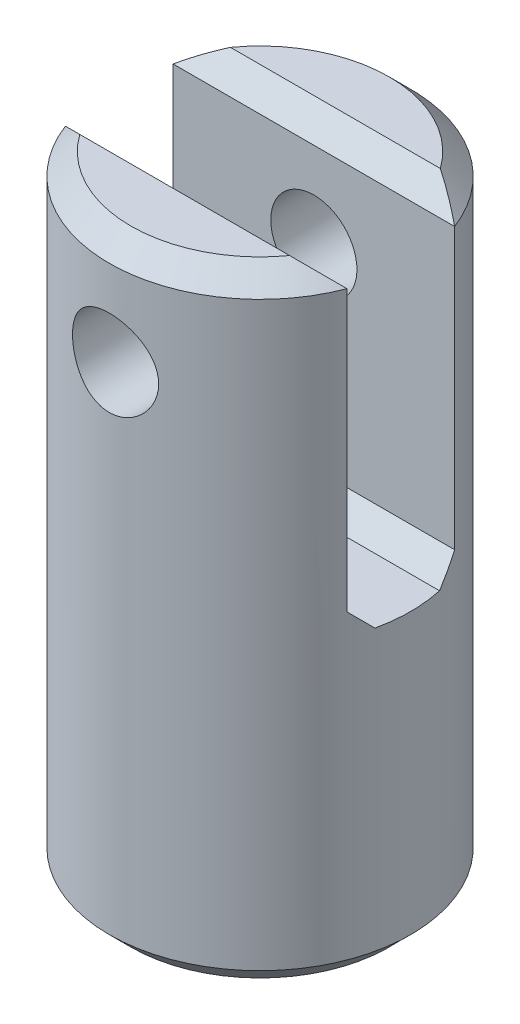
ISO-10303-21;
HEADER;
FILE_DESCRIPTION(('STEP AP214'),'2;1');
FILE_NAME('part.step','',(''),(''),'','','');
FILE_SCHEMA(('AUTOMOTIVE_DESIGN { 1 0 10303 214 1 1 1 1 }'));
ENDSEC;
DATA;
#1=APPLICATION_CONTEXT('core data for automotive mechanical design processes');
#2=APPLICATION_PROTOCOL_DEFINITION('international standard','automotive_design',2000,#1);
#3=PRODUCT_CONTEXT('',#1,'mechanical');
#4=PRODUCT('Part','Part','',(#3));
#5=PRODUCT_RELATED_PRODUCT_CATEGORY('part','',(#4));
#6=PRODUCT_DEFINITION_FORMATION('','',#4);
#7=PRODUCT_DEFINITION_CONTEXT('part definition',#1,'design');
#8=PRODUCT_DEFINITION('design','',#6,#7);
#9=PRODUCT_DEFINITION_SHAPE('','',#8);
#10=(LENGTH_UNIT() NAMED_UNIT(*) SI_UNIT(.MILLI.,.METRE.));
#11=(NAMED_UNIT(*) PLANE_ANGLE_UNIT() SI_UNIT($,.RADIAN.));
#12=(NAMED_UNIT(*) SI_UNIT($,.STERADIAN.) SOLID_ANGLE_UNIT());
#13=UNCERTAINTY_MEASURE_WITH_UNIT(LENGTH_MEASURE(1.E-05),#10,'distance_accuracy_value','');
#14=(GEOMETRIC_REPRESENTATION_CONTEXT(3) GLOBAL_UNCERTAINTY_ASSIGNED_CONTEXT((#13)) GLOBAL_UNIT_ASSIGNED_CONTEXT((#10,
#11,#12)) REPRESENTATION_CONTEXT('',''));
#15=CARTESIAN_POINT('',(0.,0.,0.));
#16=DIRECTION('',(0.,0.,1.));
#17=DIRECTION('',(1.,0.,0.));
#18=AXIS2_PLACEMENT_3D('',#15,#16,#17);
#19=CARTESIAN_POINT('',(0.,14.5,0.));
#20=DIRECTION('',(0.,1.,0.));
#21=DIRECTION('',(0.,0.,1.));
#22=AXIS2_PLACEMENT_3D('',#19,#20,#21);
#23=PLANE('',#22);
#24=DIRECTION('',(-1.,0.,0.));
#25=VECTOR('',#24,1.);
#26=CARTESIAN_POINT('',(-6.53834841531101,14.5,3.50000000000001));
#27=LINE('',#26,#25);
#28=CARTESIAN_POINT('',(4.87339717240447,14.5,3.50000000000001));
#29=VERTEX_POINT('',#28);
#30=CARTESIAN_POINT('',(-4.87339717240447,14.5,3.50000000000001));
#31=VERTEX_POINT('',#30);
#32=EDGE_CURVE('E62',#29,#31,#27,.T.);
#33=ORIENTED_EDGE('',*,*,#32,.T.);
#34=CARTESIAN_POINT('',(0.,14.5,0.));
#35=DIRECTION('',(0.,1.,0.));
#36=DIRECTION('',(0.,0.,1.));
#37=AXIS2_PLACEMENT_3D('',#34,#35,#36);
#38=CIRCLE('',#37,5.99999999999999);
#39=EDGE_CURVE('E146',#31,#29,#38,.T.);
#40=ORIENTED_EDGE('',*,*,#39,.T.);
#41=EDGE_LOOP('',(#33,#40));
#42=FACE_BOUND('',#41,.T.);
#43=ADVANCED_FACE('F39',(#42),#23,.T.);
#44=CARTESIAN_POINT('',(0.,14.5,0.));
#45=DIRECTION('',(0.,-1.,0.));
#46=DIRECTION('',(0.,0.,-1.));
#47=AXIS2_PLACEMENT_3D('',#44,#45,#46);
#48=CYLINDRICAL_SURFACE('',#47,7.);
#49=CARTESIAN_POINT('',(0.,-13.5,0.));
#50=DIRECTION('',(0.,1.,0.));
#51=DIRECTION('',(0.,0.,1.));
#52=AXIS2_PLACEMENT_3D('',#49,#50,#51);
#53=CIRCLE('',#52,7.);
#54=CARTESIAN_POINT('',(0.,-13.5,7.));
#55=VERTEX_POINT('',#54);
#56=EDGE_CURVE('E222',#55,#55,#53,.T.);
#57=ORIENTED_EDGE('',*,*,#56,.T.);
#58=EDGE_LOOP('',(#57));
#59=FACE_BOUND('',#58,.T.);
#60=CARTESIAN_POINT('',(0.,11.5,-7.));
#61=CARTESIAN_POINT('',(-0.109954902377251,11.4999980604381,-6.99999869294341));
#62=CARTESIAN_POINT('',(-0.219929747872581,11.4909022110239,-6.99738417402043));
#63=CARTESIAN_POINT('',(-0.436691991196989,11.4548357298977,-6.98720905945103));
#64=CARTESIAN_POINT('',(-0.543478166829616,11.4278583339259,-6.97964659210084));
#65=CARTESIAN_POINT('',(-0.750704300737871,11.3569919615835,-6.96040691349073));
#66=CARTESIAN_POINT('',(-0.851152880848224,11.3131265638481,-6.94873544106341));
#67=CARTESIAN_POINT('',(-1.04326876112927,11.2098220085217,-6.92249978316544));
#68=CARTESIAN_POINT('',(-1.13493514117816,11.1503812215096,-6.90793529508022));
#69=CARTESIAN_POINT('',(-1.30929444685895,11.0159649893271,-6.8770473462558));
#70=CARTESIAN_POINT('',(-1.39172372238094,10.9406552461447,-6.86069041945191));
#71=CARTESIAN_POINT('',(-1.54297135792435,10.7773522568623,-6.82826734915641));
#72=CARTESIAN_POINT('',(-1.61178767707782,10.6893571123678,-6.81220124959344));
#73=CARTESIAN_POINT('',(-1.7351979000643,10.5010064172091,-6.78183014875388));
#74=CARTESIAN_POINT('',(-1.78947821103348,10.4004380149351,-6.76756702506018));
#75=CARTESIAN_POINT('',(-1.8802517055398,10.1911279882492,-6.74291343840667));
#76=CARTESIAN_POINT('',(-1.91674871555719,10.0823881279291,-6.73252214244871));
#77=CARTESIAN_POINT('',(-1.96998433013875,9.86276523683446,-6.71713608196016));
#78=CARTESIAN_POINT('',(-1.98720553202849,9.75200863723217,-6.71200978570011));
#79=CARTESIAN_POINT('',(-2.00290667789184,9.5290688515539,-6.70734208201995));
#80=CARTESIAN_POINT('',(-2.00139069409621,9.41688598074978,-6.70779946107612));
#81=CARTESIAN_POINT('',(-1.98004134762903,9.19813138854384,-6.71413034409934));
#82=CARTESIAN_POINT('',(-1.96080325728391,9.09149564881924,-6.71982782697936));
#83=CARTESIAN_POINT('',(-1.90551386085789,8.88303278037241,-6.73571348382811));
#84=CARTESIAN_POINT('',(-1.8694610348125,8.7812060872795,-6.74590206376403));
#85=CARTESIAN_POINT('',(-1.78110681137812,8.58375375556819,-6.7697686351608));
#86=CARTESIAN_POINT('',(-1.72860551172881,8.48822292759833,-6.78348916405649));
#87=CARTESIAN_POINT('',(-1.60898379167885,8.3071234387866,-6.81285216882059));
#88=CARTESIAN_POINT('',(-1.54186011673345,8.22155700226509,-6.82849507221912));
#89=CARTESIAN_POINT('',(-1.39190399673021,8.05942762439363,-6.86066250656356));
#90=CARTESIAN_POINT('',(-1.30857487484533,7.98332552403277,-6.87719804572366));
#91=CARTESIAN_POINT('',(-1.13013228238622,7.84607399635972,-6.90876247218345));
#92=CARTESIAN_POINT('',(-1.03501820148189,7.78492534395829,-6.92379128137825));
#93=CARTESIAN_POINT('',(-0.834923073091445,7.67907126522596,-6.95076528065502));
#94=CARTESIAN_POINT('',(-0.729889817810005,7.63445971319582,-6.96269275497229));
#95=CARTESIAN_POINT('',(-0.513393229967469,7.56366610858318,-6.98199251487585));
#96=CARTESIAN_POINT('',(-0.401931525810145,7.53747941075473,-6.98936594856255));
#97=CARTESIAN_POINT('',(-0.179666388644349,7.50502671429055,-6.99854874514672));
#98=CARTESIAN_POINT('',(-0.068961346860507,7.49813530462697,-7.00053272850599));
#99=CARTESIAN_POINT('',(0.152026526805584,7.50272726630104,-6.99922084707091));
#100=CARTESIAN_POINT('',(0.262309407757109,7.51420843284592,-6.99592561580629));
#101=CARTESIAN_POINT('',(0.477018633430316,7.55471044431625,-6.98453926685206));
#102=CARTESIAN_POINT('',(0.581518211734844,7.58337318132339,-6.97654613017679));
#103=CARTESIAN_POINT('',(0.784208686205641,7.65700050198467,-6.95667998741883));
#104=CARTESIAN_POINT('',(0.882398851248718,7.70196697088934,-6.94480653265874));
#105=CARTESIAN_POINT('',(1.07204168512003,7.80802333664512,-6.91809961169145));
#106=CARTESIAN_POINT('',(1.16330248654009,7.86944119882533,-6.9032076317834));
#107=CARTESIAN_POINT('',(1.33443852805947,8.0062525059511,-6.87217947098441));
#108=CARTESIAN_POINT('',(1.41431117084304,8.08164913006457,-6.85604300755107));
#109=CARTESIAN_POINT('',(1.56310642834007,8.24720934204944,-6.82368619629443));
#110=CARTESIAN_POINT('',(1.63158542740713,8.33777527555905,-6.80748036858305));
#111=CARTESIAN_POINT('',(1.75239531606757,8.52946258862467,-6.77738894734786));
#112=CARTESIAN_POINT('',(1.8047267674867,8.63058360077126,-6.76350327310608));
#113=CARTESIAN_POINT('',(1.89137454118278,8.84009121097521,-6.73978651242836));
#114=CARTESIAN_POINT('',(1.92578633239654,8.94843576349762,-6.72993400029434));
#115=CARTESIAN_POINT('',(1.9757945006787,9.16970993557479,-6.71542456669526));
#116=CARTESIAN_POINT('',(1.99139657901587,9.28263815507641,-6.71076607094366));
#117=CARTESIAN_POINT('',(2.00298024246851,9.50529603293678,-6.70731703127619));
#118=CARTESIAN_POINT('',(1.99968027644405,9.61498550455666,-6.70831160808103));
#119=CARTESIAN_POINT('',(1.97524710957467,9.83217473066169,-6.71554597206102));
#120=CARTESIAN_POINT('',(1.95411450379873,9.93967455809192,-6.72178558421114));
#121=CARTESIAN_POINT('',(1.89505968816675,10.1483783711686,-6.73866977160527));
#122=CARTESIAN_POINT('',(1.85731091786365,10.2496353870112,-6.74926877048974));
#123=CARTESIAN_POINT('',(1.76622949301581,10.4444587344922,-6.77367302842112));
#124=CARTESIAN_POINT('',(1.71289408043152,10.5380237012732,-6.78747885482392));
#125=CARTESIAN_POINT('',(1.59006546534829,10.7181835218053,-6.81731668949935));
#126=CARTESIAN_POINT('',(1.52009227722732,10.804441391342,-6.83340763179064));
#127=CARTESIAN_POINT('',(1.36685984037935,10.9642238958098,-6.86569845092232));
#128=CARTESIAN_POINT('',(1.28359725072856,11.0377453191108,-6.88189835417168));
#129=CARTESIAN_POINT('',(1.10357432086539,11.1718371843266,-6.91307959572365));
#130=CARTESIAN_POINT('',(1.00652250235978,11.2320269872696,-6.92801901037413));
#131=CARTESIAN_POINT('',(0.803250529646663,11.335145785022,-6.95451395777971));
#132=CARTESIAN_POINT('',(0.697035424114741,11.3780842119331,-6.96607133870287));
#133=CARTESIAN_POINT('',(0.492916315335036,11.4408475513954,-6.98327344725308));
#134=CARTESIAN_POINT('',(0.395763007624392,11.4629735366846,-6.98949684362076));
#135=CARTESIAN_POINT('',(0.199078368786368,11.4925496572421,-6.99786043852147));
#136=CARTESIAN_POINT('',(0.0995473576160919,11.5000017559769,-7.00000118333996));
#137=CARTESIAN_POINT('',(0.,11.5,-7.));
#138=B_SPLINE_CURVE_WITH_KNOTS('',3,(#60,#61,#62,#63,#64,#65,#66,#67,#68,#69,#70,#71,#72,#73,
#74,#75,#76,#77,#78,#79,#80,#81,#82,#83,#84,#85,#86,#87,#88,#89,#90,#91,#92,#93,#94,#95,#96,#97,
#98,#99,#100,#101,#102,#103,#104,#105,#106,#107,#108,#109,#110,#111,#112,#113,#114,#115,#116,
#117,#118,#119,#120,#121,#122,#123,#124,#125,#126,#127,#128,#129,#130,#131,#132,#133,#134,#135,
#136,#137),.UNSPECIFIED.,.T.,.F.,(4,2,2,2,2,2,2,2,2,2,2,2,2,2,2,2,2,2,2,2,2,2,2,2,2,2,2,2,2,2,2,
2,2,2,2,2,2,2,4),(0.,0.329499312542344,0.65912333979518,0.988288812895344,1.31748873543516,
1.65447811530781,1.99151797873713,2.33533075300057,2.67906951544809,3.0139950986275,
3.34884789231233,3.67284785829333,3.99687711786126,4.3250080329121,4.65321205577343,
4.99378500602501,5.33437560155449,5.67687101104448,6.01928004014612,6.350454576982,
6.68158937434648,7.00605140479519,7.33055096575529,7.66207525344451,7.99367503187788,
8.33612104884334,8.67855514965298,9.01914573366139,9.35963305787734,9.68726681616472,
10.0148896418598,10.3391709629126,10.6635096999758,10.9986765689036,11.3339278310847,
11.6777797897016,12.0214434923409,12.3197946803794,12.6181059442772),.UNSPECIFIED.);
#139=CARTESIAN_POINT('',(0.,11.5,-7.));
#140=VERTEX_POINT('',#139);
#141=EDGE_CURVE('E245',#140,#140,#138,.T.);
#142=ORIENTED_EDGE('',*,*,#141,.T.);
#143=EDGE_LOOP('',(#142));
#144=FACE_BOUND('',#143,.T.);
#145=CARTESIAN_POINT('',(2.,9.5,6.70820393249937));
#146=CARTESIAN_POINT('',(1.99999802046393,9.39014846212276,6.70820547009708));
#147=CARTESIAN_POINT('',(1.9909186659955,9.28027691574549,6.71093179679208));
#148=CARTESIAN_POINT('',(1.95492363390195,9.06372876113703,6.72150389207102));
#149=CARTESIAN_POINT('',(1.92800070136334,8.95705347089938,6.72935174296489));
#150=CARTESIAN_POINT('',(1.85729343292866,8.7500627991285,6.74920709521546));
#151=CARTESIAN_POINT('',(1.81353520651874,8.64973784818286,6.76120815257369));
#152=CARTESIAN_POINT('',(1.71048364062938,8.45783218844563,6.78800921096146));
#153=CARTESIAN_POINT('',(1.65118845666347,8.36625251962197,6.80280954425194));
#154=CARTESIAN_POINT('',(1.51692480098199,8.19180843468517,6.83401783214154));
#155=CARTESIAN_POINT('',(1.4415892111325,8.10923219787079,6.8504575596415));
#156=CARTESIAN_POINT('',(1.27817124546927,7.95769721669621,6.88281965512018));
#157=CARTESIAN_POINT('',(1.19008737915963,7.88874006687716,6.89874196233652));
#158=CARTESIAN_POINT('',(1.00164603215759,7.76517135164649,6.92863332001512));
#159=CARTESIAN_POINT('',(0.901090783761868,7.71085038024902,6.94256054500866));
#160=CARTESIAN_POINT('',(0.691808475239641,7.61999822558403,6.96652540485531));
#161=CARTESIAN_POINT('',(0.583083010875174,7.58346357875974,6.97656379690866));
#162=CARTESIAN_POINT('',(0.36355857512118,7.53016553876029,6.99139519300235));
#163=CARTESIAN_POINT('',(0.252887798129042,7.51291097829533,6.99631827011303));
#164=CARTESIAN_POINT('',(0.0301201024219255,7.49711326611677,7.00082095659694));
#165=CARTESIAN_POINT('',(-0.0819765395885465,7.49856653766264,7.00040158738982));
#166=CARTESIAN_POINT('',(-0.300980195735219,7.51980637491803,6.99436006763307));
#167=CARTESIAN_POINT('',(-0.407943546108943,7.53906161263799,6.98888870776051));
#168=CARTESIAN_POINT('',(-0.617052222177615,7.59449510246437,6.97353886330137));
#169=CARTESIAN_POINT('',(-0.719197254300507,7.63067438426212,6.96366011056224));
#170=CARTESIAN_POINT('',(-0.917073833728921,7.71930940081182,6.94039031772111));
#171=CARTESIAN_POINT('',(-1.01272304385077,7.77193877780833,6.92696205512133));
#172=CARTESIAN_POINT('',(-1.19400724359048,7.89184458639802,6.89802768974041));
#173=CARTESIAN_POINT('',(-1.27964003241601,7.95912422766648,6.8825211319195));
#174=CARTESIAN_POINT('',(-1.44163264854775,8.10920571061859,6.85045683019623));
#175=CARTESIAN_POINT('',(-1.51756157758489,8.19246943360505,6.83388129369387));
#176=CARTESIAN_POINT('',(-1.65449301574976,8.37071509184596,6.80202973786992));
#177=CARTESIAN_POINT('',(-1.71549431378261,8.465697976949,6.78675382405366));
#178=CARTESIAN_POINT('',(-1.82123335985447,8.66573088449799,6.75915174814409));
#179=CARTESIAN_POINT('',(-1.86583737788771,8.77085522505166,6.74685010938643));
#180=CARTESIAN_POINT('',(-1.9365895149609,8.98755316350462,6.72688544387341));
#181=CARTESIAN_POINT('',(-1.9627430040271,9.09912487465991,6.71922106753542));
#182=CARTESIAN_POINT('',(-1.99507417199885,9.32148042433231,6.70969115196194));
#183=CARTESIAN_POINT('',(-2.00190148157354,9.43216181693302,6.70763711316669));
#184=CARTESIAN_POINT('',(-1.99718996719665,9.65308831592096,6.7090415959684));
#185=CARTESIAN_POINT('',(-1.98565343424642,9.76333347501092,6.71249942992568));
#186=CARTESIAN_POINT('',(-1.94511781425928,9.97764122802295,6.72435430053723));
#187=CARTESIAN_POINT('',(-1.9165246218414,10.0817875860152,6.73263642965451));
#188=CARTESIAN_POINT('',(-1.8431516186643,10.2838018719977,6.75309063930731));
#189=CARTESIAN_POINT('',(-1.79836947226768,10.3816688916456,6.7652632811114));
#190=CARTESIAN_POINT('',(-1.69261965121623,10.5710220752167,6.79250188009389));
#191=CARTESIAN_POINT('',(-1.63127891729131,10.6622904442022,6.80763197381122));
#192=CARTESIAN_POINT('',(-1.49460463684841,10.8334763734434,6.83893726549831));
#193=CARTESIAN_POINT('',(-1.41926805768137,10.9133914670121,6.85511268947611));
#194=CARTESIAN_POINT('',(-1.25370800996556,11.0623794182882,6.88734727436087));
#195=CARTESIAN_POINT('',(-1.16306771024055,11.1309949714187,6.90338406046143));
#196=CARTESIAN_POINT('',(-0.971185307057545,11.2520456813827,6.93297977045999));
#197=CARTESIAN_POINT('',(-0.869943758098183,11.3044816839224,6.94653882385412));
#198=CARTESIAN_POINT('',(-0.660433272956165,11.3911842870263,6.96956504846406));
#199=CARTESIAN_POINT('',(-0.552224799899635,11.4255883895862,6.97906308127248));
#200=CARTESIAN_POINT('',(-0.331245648549923,11.4756268019402,6.99303339623885));
#201=CARTESIAN_POINT('',(-0.218476151585438,11.4912659401813,6.99750697123019));
#202=CARTESIAN_POINT('',(0.00417823795902851,11.5029914339978,7.00085335003284));
#203=CARTESIAN_POINT('',(0.114025631049956,11.4997441490828,6.99991703588995));
#204=CARTESIAN_POINT('',(0.331545172422003,11.4753617185897,6.99299069122135));
#205=CARTESIAN_POINT('',(0.439217424617531,11.454227429618,6.98700090270593));
#206=CARTESIAN_POINT('',(0.648404133039587,11.3950686390212,6.97068801860116));
#207=CARTESIAN_POINT('',(0.749965033435049,11.357196821056,6.96040414048174));
#208=CARTESIAN_POINT('',(0.945347202761462,11.2657738417145,6.93657094143453));
#209=CARTESIAN_POINT('',(1.03916727058068,11.2122202529078,6.92302111501785));
#210=CARTESIAN_POINT('',(1.21943345635391,11.0891026625752,6.89358955440188));
#211=CARTESIAN_POINT('',(1.30557732800707,11.0191099132116,6.8776504578623));
#212=CARTESIAN_POINT('',(1.46512122231838,10.8658908745461,6.84544064986529));
#213=CARTESIAN_POINT('',(1.5385177121898,10.7826609289152,6.82916984787116));
#214=CARTESIAN_POINT('',(1.67240846029126,10.6027030830045,6.79764037543869));
#215=CARTESIAN_POINT('',(1.73251316723594,10.5056780524965,6.78241951768489));
#216=CARTESIAN_POINT('',(1.83547943619619,10.3024781346854,6.7552844533164));
#217=CARTESIAN_POINT('',(1.8783506488486,10.1963084089117,6.74336839719835));
#218=CARTESIAN_POINT('',(1.94098534012467,9.99234629976735,6.72558459556592));
#219=CARTESIAN_POINT('',(1.96305899981724,9.89530965189748,6.71912438833989));
#220=CARTESIAN_POINT('',(1.99256607043695,9.69885388164808,6.71043369466525));
#221=CARTESIAN_POINT('',(2.00000179183146,9.5994351377689,6.70820254070056));
#222=CARTESIAN_POINT('',(2.,9.5,6.70820393249937));
#223=B_SPLINE_CURVE_WITH_KNOTS('',3,(#145,#146,#147,#148,#149,#150,#151,#152,#153,#154,#155,
#156,#157,#158,#159,#160,#161,#162,#163,#164,#165,#166,#167,#168,#169,#170,#171,#172,#173,#174,
#175,#176,#177,#178,#179,#180,#181,#182,#183,#184,#185,#186,#187,#188,#189,#190,#191,#192,#193,
#194,#195,#196,#197,#198,#199,#200,#201,#202,#203,#204,#205,#206,#207,#208,#209,#210,#211,#212,
#213,#214,#215,#216,#217,#218,#219,#220,#221,#222),.UNSPECIFIED.,.T.,.F.,(4,2,2,2,2,2,2,2,2,2,2,
2,2,2,2,2,2,2,2,2,2,2,2,2,2,2,2,2,2,2,2,2,2,2,2,2,2,2,4),(0.,0.32918834236395,0.658510609618862,
0.987324183736439,1.31617681100735,1.65357167206616,1.99100601238483,2.33471483013846,
2.67835669017706,3.01302901028742,3.34763734552418,3.67257037643421,3.99752317946522,
4.32602903378491,4.65460693184835,4.99471612693,5.3348529062976,5.67770520630006,
6.02045767793011,6.3515436333348,6.68258828698449,7.00605289656511,7.32956419216041,
7.66108006042381,7.99266784620105,8.33545388376657,8.67822200084647,9.01833685298089,
9.35836417076638,9.6864689768406,10.0145580709057,10.3397141238921,10.6649205354322,
10.9997976874537,11.3347674991531,11.6785361242131,12.0221119721565,12.3201328886649,
12.61810676147),.UNSPECIFIED.);
#224=CARTESIAN_POINT('',(2.,9.5,6.70820393249937));
#225=VERTEX_POINT('',#224);
#226=EDGE_CURVE('E248',#225,#225,#223,.T.);
#227=ORIENTED_EDGE('',*,*,#226,.T.);
#228=EDGE_LOOP('',(#227));
#229=FACE_BOUND('',#228,.T.);
#230=DIRECTION('',(0.,-1.,0.));
#231=VECTOR('',#230,1.);
#232=CARTESIAN_POINT('',(-6.53834841531101,14.5,-2.5));
#233=LINE('',#232,#231);
#234=CARTESIAN_POINT('',(-6.53834841531101,0.500000000000013,-2.5));
#235=VERTEX_POINT('',#234);
#236=CARTESIAN_POINT('',(-6.53834841531101,13.5,-2.5));
#237=VERTEX_POINT('',#236);
#238=EDGE_CURVE('E251',#235,#237,#233,.F.);
#239=ORIENTED_EDGE('',*,*,#238,.T.);
#240=CARTESIAN_POINT('',(0.,13.5,0.));
#241=DIRECTION('',(0.,1.,0.));
#242=DIRECTION('',(0.,0.,1.));
#243=AXIS2_PLACEMENT_3D('',#240,#241,#242);
#244=CIRCLE('',#243,7.);
#245=CARTESIAN_POINT('',(6.53834841531101,13.5,-2.5));
#246=VERTEX_POINT('',#245);
#247=EDGE_CURVE('E121',#237,#246,#244,.F.);
#248=ORIENTED_EDGE('',*,*,#247,.T.);
#249=DIRECTION('',(0.,-1.,0.));
#250=VECTOR('',#249,1.);
#251=CARTESIAN_POINT('',(6.53834841531101,14.5,-2.5));
#252=LINE('',#251,#250);
#253=CARTESIAN_POINT('',(6.53834841531101,0.500000000000013,-2.5));
#254=VERTEX_POINT('',#253);
#255=EDGE_CURVE('E217',#246,#254,#252,.T.);
#256=ORIENTED_EDGE('',*,*,#255,.T.);
#257=CARTESIAN_POINT('',(0.,-2.00000000000002,0.));
#258=DIRECTION('',(0.,0.707106781186544,0.707106781186551));
#259=DIRECTION('',(0.,-0.707106781186551,0.707106781186544));
#260=AXIS2_PLACEMENT_3D('',#257,#258,#259);
#261=ELLIPSE('',#260,9.89949493661172,7.);
#262=CARTESIAN_POINT('',(6.83739716558867,-0.499999999999999,-1.5));
#263=VERTEX_POINT('',#262);
#264=EDGE_CURVE('E55',#254,#263,#261,.F.);
#265=ORIENTED_EDGE('',*,*,#264,.T.);
#266=CARTESIAN_POINT('',(0.,-0.499999999999999,0.));
#267=DIRECTION('',(0.,-1.,0.));
#268=DIRECTION('',(0.,0.,-1.));
#269=AXIS2_PLACEMENT_3D('',#266,#267,#268);
#270=CIRCLE('',#269,7.);
#271=CARTESIAN_POINT('',(6.83739716558867,-0.499999999999999,1.49999999999999));
#272=VERTEX_POINT('',#271);
#273=EDGE_CURVE('E212',#263,#272,#270,.T.);
#274=ORIENTED_EDGE('',*,*,#273,.T.);
#275=CARTESIAN_POINT('',(0.,-1.99999999999998,0.));
#276=DIRECTION('',(0.,0.707106781186551,-0.707106781186544));
#277=DIRECTION('',(0.,-0.707106781186544,-0.707106781186551));
#278=AXIS2_PLACEMENT_3D('',#275,#276,#277);
#279=ELLIPSE('',#278,9.89949493661162,7.);
#280=CARTESIAN_POINT('',(6.53834841531101,0.500000000000002,2.5));
#281=VERTEX_POINT('',#280);
#282=EDGE_CURVE('E157',#272,#281,#279,.F.);
#283=ORIENTED_EDGE('',*,*,#282,.T.);
#284=DIRECTION('',(0.,-1.,0.));
#285=VECTOR('',#284,1.);
#286=CARTESIAN_POINT('',(6.53834841531101,14.5,2.5));
#287=LINE('',#286,#285);
#288=CARTESIAN_POINT('',(6.53834841531101,13.5,2.5));
#289=VERTEX_POINT('',#288);
#290=EDGE_CURVE('E209',#281,#289,#287,.F.);
#291=ORIENTED_EDGE('',*,*,#290,.T.);
#292=CARTESIAN_POINT('',(0.,13.5,0.));
#293=DIRECTION('',(0.,1.,0.));
#294=DIRECTION('',(0.,0.,1.));
#295=AXIS2_PLACEMENT_3D('',#292,#293,#294);
#296=CIRCLE('',#295,7.);
#297=CARTESIAN_POINT('',(-6.53834841531101,13.5,2.5));
#298=VERTEX_POINT('',#297);
#299=EDGE_CURVE('E133',#289,#298,#296,.F.);
#300=ORIENTED_EDGE('',*,*,#299,.T.);
#301=DIRECTION('',(0.,-1.,0.));
#302=VECTOR('',#301,1.);
#303=CARTESIAN_POINT('',(-6.53834841531101,14.5,2.5));
#304=LINE('',#303,#302);
#305=CARTESIAN_POINT('',(-6.53834841531101,0.500000000000002,2.5));
#306=VERTEX_POINT('',#305);
#307=EDGE_CURVE('E207',#298,#306,#304,.T.);
#308=ORIENTED_EDGE('',*,*,#307,.T.);
#309=CARTESIAN_POINT('',(0.,-1.99999999999998,0.));
#310=DIRECTION('',(0.,0.707106781186551,-0.707106781186544));
#311=DIRECTION('',(0.,-0.707106781186544,-0.707106781186551));
#312=AXIS2_PLACEMENT_3D('',#309,#310,#311);
#313=ELLIPSE('',#312,9.89949493661162,7.);
#314=CARTESIAN_POINT('',(-6.83739716558867,-0.499999999999999,1.49999999999999));
#315=VERTEX_POINT('',#314);
#316=EDGE_CURVE('E159',#306,#315,#313,.F.);
#317=ORIENTED_EDGE('',*,*,#316,.T.);
#318=CARTESIAN_POINT('',(-6.83739716558867,-0.499999999999999,-1.5));
#319=VERTEX_POINT('',#318);
#320=EDGE_CURVE('E215',#315,#319,#270,.T.);
#321=ORIENTED_EDGE('',*,*,#320,.T.);
#322=CARTESIAN_POINT('',(0.,-2.00000000000002,0.));
#323=DIRECTION('',(0.,0.707106781186544,0.707106781186551));
#324=DIRECTION('',(0.,-0.707106781186551,0.707106781186544));
#325=AXIS2_PLACEMENT_3D('',#322,#323,#324);
#326=ELLIPSE('',#325,9.89949493661172,7.);
#327=EDGE_CURVE('E11',#319,#235,#326,.F.);
#328=ORIENTED_EDGE('',*,*,#327,.T.);
#329=EDGE_LOOP('',(#239,#248,#256,#265,#274,#283,#291,#300,#308,#317,#321,#328));
#330=FACE_BOUND('',#329,.T.);
#331=ADVANCED_FACE('F206',(#59,#144,#229,#330),#48,.T.);
#332=DIRECTION('',(1.,0.,0.));
#333=VECTOR('',#332,1.);
#334=CARTESIAN_POINT('',(6.53834841531101,14.5,-3.50000000000001));
#335=LINE('',#334,#333);
#336=CARTESIAN_POINT('',(-4.87339717240447,14.5,-3.50000000000001));
#337=VERTEX_POINT('',#336);
#338=CARTESIAN_POINT('',(4.87339717240447,14.5,-3.50000000000001));
#339=VERTEX_POINT('',#338);
#340=EDGE_CURVE('E127',#337,#339,#335,.T.);
#341=ORIENTED_EDGE('',*,*,#340,.T.);
#342=CARTESIAN_POINT('',(0.,14.5,0.));
#343=DIRECTION('',(0.,1.,0.));
#344=DIRECTION('',(0.,0.,1.));
#345=AXIS2_PLACEMENT_3D('',#342,#343,#344);
#346=CIRCLE('',#345,5.99999999999999);
#347=EDGE_CURVE('E119',#339,#337,#346,.T.);
#348=ORIENTED_EDGE('',*,*,#347,.T.);
#349=EDGE_LOOP('',(#341,#348));
#350=FACE_BOUND('',#349,.T.);
#351=ADVANCED_FACE('F132',(#350),#23,.T.);
#352=CARTESIAN_POINT('',(0.,-14.5,0.));
#353=DIRECTION('',(0.,1.,0.));
#354=DIRECTION('',(0.,0.,1.));
#355=AXIS2_PLACEMENT_3D('',#352,#353,#354);
#356=PLANE('',#355);
#357=CARTESIAN_POINT('',(0.,-14.5,0.));
#358=DIRECTION('',(0.,1.,0.));
#359=DIRECTION('',(0.,0.,1.));
#360=AXIS2_PLACEMENT_3D('',#357,#358,#359);
#361=CIRCLE('',#360,5.99999999999997);
#362=CARTESIAN_POINT('',(0.,-14.5,5.99999999999997));
#363=VERTEX_POINT('',#362);
#364=EDGE_CURVE('E130',#363,#363,#361,.F.);
#365=ORIENTED_EDGE('',*,*,#364,.T.);
#366=EDGE_LOOP('',(#365));
#367=FACE_BOUND('',#366,.T.);
#368=ADVANCED_FACE('F231',(#367),#356,.F.);
#369=CARTESIAN_POINT('',(-7.,-0.499999999999999,2.5));
#370=DIRECTION('',(0.,-1.,0.));
#371=DIRECTION('',(0.,0.,-1.));
#372=AXIS2_PLACEMENT_3D('',#369,#370,#371);
#373=PLANE('',#372);
#374=ORIENTED_EDGE('',*,*,#320,.F.);
#375=DIRECTION('',(1.,0.,0.));
#376=VECTOR('',#375,1.);
#377=CARTESIAN_POINT('',(6.53834841531101,-0.499999999999999,1.49999999999999));
#378=LINE('',#377,#376);
#379=EDGE_CURVE('E154',#315,#272,#378,.T.);
#380=ORIENTED_EDGE('',*,*,#379,.T.);
#381=ORIENTED_EDGE('',*,*,#273,.F.);
#382=DIRECTION('',(-1.,0.,0.));
#383=VECTOR('',#382,1.);
#384=CARTESIAN_POINT('',(-6.53834841531101,-0.499999999999999,-1.5));
#385=LINE('',#384,#383);
#386=EDGE_CURVE('E152',#263,#319,#385,.T.);
#387=ORIENTED_EDGE('',*,*,#386,.T.);
#388=EDGE_LOOP('',(#374,#380,#381,#387));
#389=FACE_BOUND('',#388,.T.);
#390=ADVANCED_FACE('F275',(#389),#373,.F.);
#391=CARTESIAN_POINT('',(-7.,14.5,2.5));
#392=DIRECTION('',(0.,0.,1.));
#393=DIRECTION('',(1.,0.,0.));
#394=AXIS2_PLACEMENT_3D('',#391,#392,#393);
#395=PLANE('',#394);
#396=CARTESIAN_POINT('',(0.,9.5,2.5));
#397=DIRECTION('',(0.,0.,1.));
#398=DIRECTION('',(1.,0.,0.));
#399=AXIS2_PLACEMENT_3D('',#396,#397,#398);
#400=CIRCLE('',#399,2.);
#401=CARTESIAN_POINT('',(2.,9.5,2.5));
#402=VERTEX_POINT('',#401);
#403=EDGE_CURVE('E226',#402,#402,#400,.T.);
#404=ORIENTED_EDGE('',*,*,#403,.T.);
#405=EDGE_LOOP('',(#404));
#406=FACE_BOUND('',#405,.T.);
#407=ORIENTED_EDGE('',*,*,#307,.F.);
#408=DIRECTION('',(1.,0.,0.));
#409=VECTOR('',#408,1.);
#410=CARTESIAN_POINT('',(6.53834841531101,13.5,2.5));
#411=LINE('',#410,#409);
#412=EDGE_CURVE('E150',#298,#289,#411,.T.);
#413=ORIENTED_EDGE('',*,*,#412,.T.);
#414=ORIENTED_EDGE('',*,*,#290,.F.);
#415=DIRECTION('',(-1.,0.,0.));
#416=VECTOR('',#415,1.);
#417=CARTESIAN_POINT('',(-6.53834841531101,0.499999999999999,2.5));
#418=LINE('',#417,#416);
#419=EDGE_CURVE('E148',#281,#306,#418,.T.);
#420=ORIENTED_EDGE('',*,*,#419,.T.);
#421=EDGE_LOOP('',(#407,#413,#414,#420));
#422=FACE_BOUND('',#421,.T.);
#423=ADVANCED_FACE('F210',(#406,#422),#395,.F.);
#424=CARTESIAN_POINT('',(-7.,14.5,-2.5));
#425=DIRECTION('',(0.,0.,-1.));
#426=DIRECTION('',(-1.,0.,0.));
#427=AXIS2_PLACEMENT_3D('',#424,#425,#426);
#428=PLANE('',#427);
#429=CARTESIAN_POINT('',(0.,9.5,-2.5));
#430=DIRECTION('',(0.,0.,-1.));
#431=DIRECTION('',(-1.,0.,0.));
#432=AXIS2_PLACEMENT_3D('',#429,#430,#431);
#433=CIRCLE('',#432,2.);
#434=CARTESIAN_POINT('',(-2.,9.5,-2.5));
#435=VERTEX_POINT('',#434);
#436=EDGE_CURVE('E223',#435,#435,#433,.T.);
#437=ORIENTED_EDGE('',*,*,#436,.T.);
#438=EDGE_LOOP('',(#437));
#439=FACE_BOUND('',#438,.T.);
#440=ORIENTED_EDGE('',*,*,#255,.F.);
#441=DIRECTION('',(-1.,0.,0.));
#442=VECTOR('',#441,1.);
#443=CARTESIAN_POINT('',(-6.53834841531101,13.5,-2.5));
#444=LINE('',#443,#442);
#445=EDGE_CURVE('E143',#246,#237,#444,.T.);
#446=ORIENTED_EDGE('',*,*,#445,.T.);
#447=ORIENTED_EDGE('',*,*,#238,.F.);
#448=DIRECTION('',(1.,0.,0.));
#449=VECTOR('',#448,1.);
#450=CARTESIAN_POINT('',(6.53834841531101,0.500000000000009,-2.5));
#451=LINE('',#450,#449);
#452=EDGE_CURVE('E140',#235,#254,#451,.T.);
#453=ORIENTED_EDGE('',*,*,#452,.T.);
#454=EDGE_LOOP('',(#440,#446,#447,#453));
#455=FACE_BOUND('',#454,.T.);
#456=ADVANCED_FACE('F269',(#439,#455),#428,.F.);
#457=CARTESIAN_POINT('',(0.,9.5,-7.));
#458=DIRECTION('',(0.,0.,1.));
#459=DIRECTION('',(1.,0.,0.));
#460=AXIS2_PLACEMENT_3D('',#457,#458,#459);
#461=CYLINDRICAL_SURFACE('',#460,2.);
#462=ORIENTED_EDGE('',*,*,#436,.F.);
#463=EDGE_LOOP('',(#462));
#464=FACE_BOUND('',#463,.T.);
#465=ORIENTED_EDGE('',*,*,#141,.F.);
#466=EDGE_LOOP('',(#465));
#467=FACE_BOUND('',#466,.T.);
#468=ADVANCED_FACE('F265',(#464,#467),#461,.F.);
#469=ORIENTED_EDGE('',*,*,#403,.F.);
#470=EDGE_LOOP('',(#469));
#471=FACE_BOUND('',#470,.T.);
#472=ORIENTED_EDGE('',*,*,#226,.F.);
#473=EDGE_LOOP('',(#472));
#474=FACE_BOUND('',#473,.T.);
#475=ADVANCED_FACE('F236',(#471,#474),#461,.F.);
#476=CARTESIAN_POINT('',(0.,-13.5,0.));
#477=DIRECTION('',(0.,1.,0.));
#478=DIRECTION('',(0.,0.,1.));
#479=AXIS2_PLACEMENT_3D('',#476,#477,#478);
#480=CONICAL_SURFACE('',#479,7.,0.785398163397449);
#481=ORIENTED_EDGE('',*,*,#364,.F.);
#482=EDGE_LOOP('',(#481));
#483=FACE_BOUND('',#482,.T.);
#484=ORIENTED_EDGE('',*,*,#56,.F.);
#485=EDGE_LOOP('',(#484));
#486=FACE_BOUND('',#485,.T.);
#487=ADVANCED_FACE('F233',(#483,#486),#480,.T.);
#488=CARTESIAN_POINT('',(-7.,13.5,-2.5));
#489=DIRECTION('',(0.,0.707106781186549,0.707106781186546));
#490=DIRECTION('',(1.,0.,0.));
#491=AXIS2_PLACEMENT_3D('',#488,#489,#490);
#492=PLANE('',#491);
#493=CARTESIAN_POINT('',(-4.87339717240447,14.5,-3.50000000000001));
#494=CARTESIAN_POINT('',(-5.02099695489257,14.4242737782293,-3.42427377822931));
#495=CARTESIAN_POINT('',(-5.16627400590019,14.3463176044438,-3.34631760444381));
#496=CARTESIAN_POINT('',(-5.45219743385219,14.1865261904626,-3.18652619046258));
#497=CARTESIAN_POINT('',(-5.59284955314333,14.1046960940887,-3.10469609408875));
#498=CARTESIAN_POINT('',(-5.86988248835439,13.9375611202843,-2.93756112028432));
#499=CARTESIAN_POINT('',(-6.00626440223141,13.8522571492534,-2.85225714925341));
#500=CARTESIAN_POINT('',(-6.27518540897981,13.6784268101467,-2.67842681014668));
#501=CARTESIAN_POINT('',(-6.40771930396997,13.5898964173372,-2.5898964173372));
#502=CARTESIAN_POINT('',(-6.53834841531101,13.5,-2.5));
#503=B_SPLINE_CURVE_WITH_KNOTS('',3,(#493,#494,#495,#496,#497,#498,#499,#500,#501,#502),
.UNSPECIFIED.,.F.,.F.,(4,2,2,2,4),(0.,0.546993206975374,1.09327943885266,1.63942403626377,
2.18627494231009),.UNSPECIFIED.);
#504=EDGE_CURVE('E115',#237,#337,#503,.F.);
#505=ORIENTED_EDGE('',*,*,#504,.F.);
#506=ORIENTED_EDGE('',*,*,#445,.F.);
#507=CARTESIAN_POINT('',(6.53834841531101,13.5,-2.5));
#508=CARTESIAN_POINT('',(6.40771930396997,13.5898964173372,-2.5898964173372));
#509=CARTESIAN_POINT('',(6.27518540897981,13.6784268101467,-2.67842681014669));
#510=CARTESIAN_POINT('',(6.00626440223141,13.8522571492534,-2.85225714925341));
#511=CARTESIAN_POINT('',(5.86988248835439,13.9375611202843,-2.93756112028432));
#512=CARTESIAN_POINT('',(5.59284955314333,14.1046960940887,-3.10469609408875));
#513=CARTESIAN_POINT('',(5.45219743385219,14.1865261904626,-3.18652619046258));
#514=CARTESIAN_POINT('',(5.16627400590019,14.3463176044438,-3.34631760444381));
#515=CARTESIAN_POINT('',(5.02099695489257,14.4242737782293,-3.42427377822931));
#516=CARTESIAN_POINT('',(4.87339717240447,14.5,-3.50000000000001));
#517=B_SPLINE_CURVE_WITH_KNOTS('',3,(#507,#508,#509,#510,#511,#512,#513,#514,#515,#516),
.UNSPECIFIED.,.F.,.F.,(4,2,2,2,4),(0.,0.546850906046319,1.09299550345743,1.63928173533471,
2.18627494231009),.UNSPECIFIED.);
#518=EDGE_CURVE('E124',#339,#246,#517,.F.);
#519=ORIENTED_EDGE('',*,*,#518,.F.);
#520=ORIENTED_EDGE('',*,*,#340,.F.);
#521=EDGE_LOOP('',(#505,#506,#519,#520));
#522=FACE_BOUND('',#521,.T.);
#523=ADVANCED_FACE('F128',(#522),#492,.T.);
#524=CARTESIAN_POINT('',(0.,14.5,0.));
#525=DIRECTION('',(0.,-1.,0.));
#526=DIRECTION('',(0.,0.,-1.));
#527=AXIS2_PLACEMENT_3D('',#524,#525,#526);
#528=CONICAL_SURFACE('',#527,5.99999999999999,0.78539816339745);
#529=ORIENTED_EDGE('',*,*,#518,.T.);
#530=ORIENTED_EDGE('',*,*,#247,.F.);
#531=ORIENTED_EDGE('',*,*,#504,.T.);
#532=ORIENTED_EDGE('',*,*,#347,.F.);
#533=EDGE_LOOP('',(#529,#530,#531,#532));
#534=FACE_BOUND('',#533,.T.);
#535=ADVANCED_FACE('F117',(#534),#528,.T.);
#536=CARTESIAN_POINT('',(-7.,13.5,2.5));
#537=DIRECTION('',(0.,0.707106781186549,-0.707106781186546));
#538=DIRECTION('',(-1.,0.,0.));
#539=AXIS2_PLACEMENT_3D('',#536,#537,#538);
#540=PLANE('',#539);
#541=CARTESIAN_POINT('',(4.87339717240447,14.5,3.50000000000001));
#542=CARTESIAN_POINT('',(5.02099695489257,14.4242737782293,3.42427377822931));
#543=CARTESIAN_POINT('',(5.16627400590019,14.3463176044438,3.34631760444381));
#544=CARTESIAN_POINT('',(5.45219743385219,14.1865261904626,3.18652619046258));
#545=CARTESIAN_POINT('',(5.59284955314333,14.1046960940887,3.10469609408875));
#546=CARTESIAN_POINT('',(5.86988248835439,13.9375611202843,2.93756112028432));
#547=CARTESIAN_POINT('',(6.00626440223141,13.8522571492534,2.85225714925341));
#548=CARTESIAN_POINT('',(6.27518540897981,13.6784268101467,2.67842681014668));
#549=CARTESIAN_POINT('',(6.40771930396997,13.5898964173372,2.5898964173372));
#550=CARTESIAN_POINT('',(6.53834841531101,13.5,2.5));
#551=B_SPLINE_CURVE_WITH_KNOTS('',3,(#541,#542,#543,#544,#545,#546,#547,#548,#549,#550),
.UNSPECIFIED.,.F.,.F.,(4,2,2,2,4),(0.,0.546993206975374,1.09327943885266,1.63942403626377,
2.18627494231009),.UNSPECIFIED.);
#552=EDGE_CURVE('E70',#289,#29,#551,.F.);
#553=ORIENTED_EDGE('',*,*,#552,.F.);
#554=ORIENTED_EDGE('',*,*,#412,.F.);
#555=CARTESIAN_POINT('',(-6.53834841531101,13.5,2.5));
#556=CARTESIAN_POINT('',(-6.40771930396997,13.5898964173372,2.5898964173372));
#557=CARTESIAN_POINT('',(-6.27518540897981,13.6784268101467,2.67842681014669));
#558=CARTESIAN_POINT('',(-6.00626440223141,13.8522571492534,2.85225714925341));
#559=CARTESIAN_POINT('',(-5.86988248835439,13.9375611202843,2.93756112028432));
#560=CARTESIAN_POINT('',(-5.59284955314333,14.1046960940887,3.10469609408875));
#561=CARTESIAN_POINT('',(-5.45219743385219,14.1865261904626,3.18652619046258));
#562=CARTESIAN_POINT('',(-5.16627400590019,14.3463176044438,3.34631760444381));
#563=CARTESIAN_POINT('',(-5.02099695489257,14.4242737782293,3.42427377822931));
#564=CARTESIAN_POINT('',(-4.87339717240447,14.5,3.50000000000001));
#565=B_SPLINE_CURVE_WITH_KNOTS('',3,(#555,#556,#557,#558,#559,#560,#561,#562,#563,#564),
.UNSPECIFIED.,.F.,.F.,(4,2,2,2,4),(0.,0.546850906046319,1.09299550345743,1.63928173533471,
2.18627494231009),.UNSPECIFIED.);
#566=EDGE_CURVE('E44',#31,#298,#565,.F.);
#567=ORIENTED_EDGE('',*,*,#566,.F.);
#568=ORIENTED_EDGE('',*,*,#32,.F.);
#569=EDGE_LOOP('',(#553,#554,#567,#568));
#570=FACE_BOUND('',#569,.T.);
#571=ADVANCED_FACE('F181',(#570),#540,.T.);
#572=CARTESIAN_POINT('',(0.,14.5,0.));
#573=DIRECTION('',(0.,-1.,0.));
#574=DIRECTION('',(0.,0.,-1.));
#575=AXIS2_PLACEMENT_3D('',#572,#573,#574);
#576=CONICAL_SURFACE('',#575,5.99999999999999,0.78539816339745);
#577=ORIENTED_EDGE('',*,*,#566,.T.);
#578=ORIENTED_EDGE('',*,*,#299,.F.);
#579=ORIENTED_EDGE('',*,*,#552,.T.);
#580=ORIENTED_EDGE('',*,*,#39,.F.);
#581=EDGE_LOOP('',(#577,#578,#579,#580));
#582=FACE_BOUND('',#581,.T.);
#583=ADVANCED_FACE('F190',(#582),#576,.T.);
#584=CARTESIAN_POINT('',(-7.,-0.499999999999999,1.49999999999999));
#585=DIRECTION('',(0.,0.707106781186551,-0.707106781186544));
#586=DIRECTION('',(-1.,0.,0.));
#587=AXIS2_PLACEMENT_3D('',#584,#585,#586);
#588=PLANE('',#587);
#589=ORIENTED_EDGE('',*,*,#316,.F.);
#590=ORIENTED_EDGE('',*,*,#419,.F.);
#591=ORIENTED_EDGE('',*,*,#282,.F.);
#592=ORIENTED_EDGE('',*,*,#379,.F.);
#593=EDGE_LOOP('',(#589,#590,#591,#592));
#594=FACE_BOUND('',#593,.T.);
#595=ADVANCED_FACE('F355',(#594),#588,.T.);
#596=CARTESIAN_POINT('',(-7.,0.500000000000009,-2.5));
#597=DIRECTION('',(0.,0.707106781186544,0.707106781186551));
#598=DIRECTION('',(-1.,0.,0.));
#599=AXIS2_PLACEMENT_3D('',#596,#597,#598);
#600=PLANE('',#599);
#601=ORIENTED_EDGE('',*,*,#327,.F.);
#602=ORIENTED_EDGE('',*,*,#386,.F.);
#603=ORIENTED_EDGE('',*,*,#264,.F.);
#604=ORIENTED_EDGE('',*,*,#452,.F.);
#605=EDGE_LOOP('',(#601,#602,#603,#604));
#606=FACE_BOUND('',#605,.T.);
#607=ADVANCED_FACE('F42',(#606),#600,.T.);
#608=CLOSED_SHELL('',(#43,#331,#351,#368,#390,#423,#456,#468,#475,#487,#523,#535,#571,#583,#595,#607));
#609=MANIFOLD_SOLID_BREP('B2',#608);
#610=ADVANCED_BREP_SHAPE_REPRESENTATION('',(#18,#609),#14);
#611=SHAPE_DEFINITION_REPRESENTATION(#9,#610);
ENDSEC;
END-ISO-10303-21;
